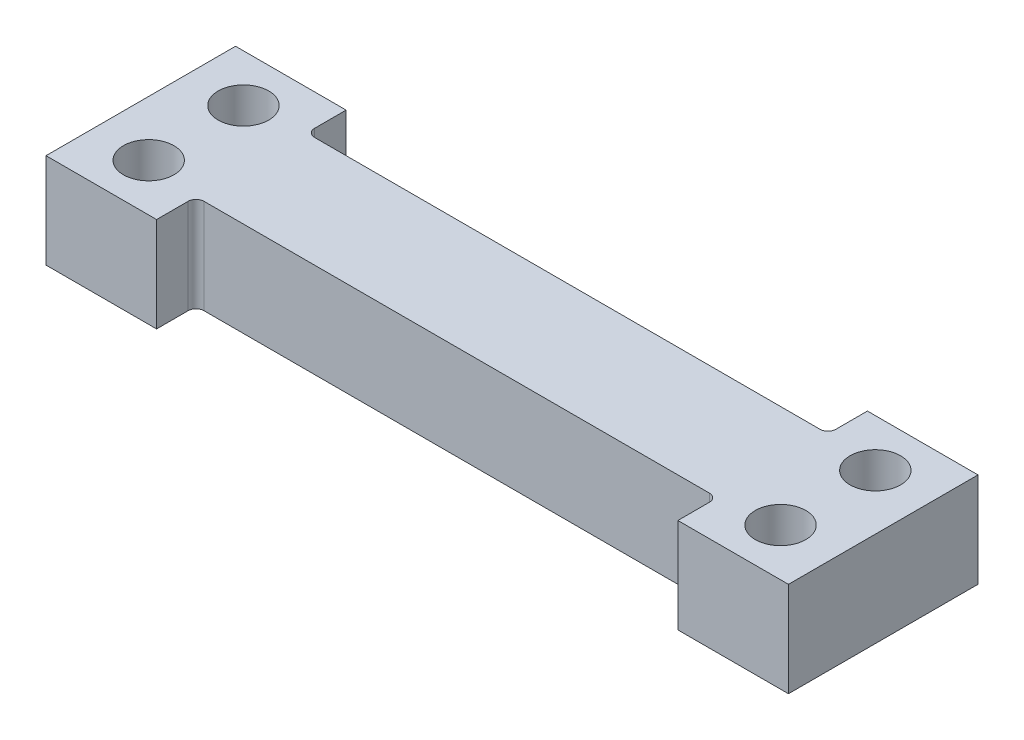
ISO-10303-21;
HEADER;
FILE_DESCRIPTION(('STEP AP214'),'2;1');
FILE_NAME('part.step','',(''),(''),'','','');
FILE_SCHEMA(('AUTOMOTIVE_DESIGN { 1 0 10303 214 1 1 1 1 }'));
ENDSEC;
DATA;
#1=APPLICATION_CONTEXT('core data for automotive mechanical design processes');
#2=APPLICATION_PROTOCOL_DEFINITION('international standard','automotive_design',2000,#1);
#3=PRODUCT_CONTEXT('',#1,'mechanical');
#4=PRODUCT('Part','Part','',(#3));
#5=PRODUCT_RELATED_PRODUCT_CATEGORY('part','',(#4));
#6=PRODUCT_DEFINITION_FORMATION('','',#4);
#7=PRODUCT_DEFINITION_CONTEXT('part definition',#1,'design');
#8=PRODUCT_DEFINITION('design','',#6,#7);
#9=PRODUCT_DEFINITION_SHAPE('','',#8);
#10=(LENGTH_UNIT() NAMED_UNIT(*) SI_UNIT(.MILLI.,.METRE.));
#11=(NAMED_UNIT(*) PLANE_ANGLE_UNIT() SI_UNIT($,.RADIAN.));
#12=(NAMED_UNIT(*) SI_UNIT($,.STERADIAN.) SOLID_ANGLE_UNIT());
#13=UNCERTAINTY_MEASURE_WITH_UNIT(LENGTH_MEASURE(1.E-05),#10,'distance_accuracy_value','');
#14=(GEOMETRIC_REPRESENTATION_CONTEXT(3) GLOBAL_UNCERTAINTY_ASSIGNED_CONTEXT((#13)) GLOBAL_UNIT_ASSIGNED_CONTEXT((#10,
#11,#12)) REPRESENTATION_CONTEXT('',''));
#15=CARTESIAN_POINT('',(0.,0.,0.));
#16=DIRECTION('',(0.,0.,1.));
#17=DIRECTION('',(1.,0.,0.));
#18=AXIS2_PLACEMENT_3D('',#15,#16,#17);
#19=CARTESIAN_POINT('',(0.,6.,0.));
#20=DIRECTION('',(0.,-1.,0.));
#21=DIRECTION('',(0.,0.,-1.));
#22=AXIS2_PLACEMENT_3D('',#19,#20,#21);
#23=PLANE('',#22);
#24=DIRECTION('',(1.,0.,0.));
#25=VECTOR('',#24,1.);
#26=CARTESIAN_POINT('',(7.,6.,0.));
#27=LINE('',#26,#25);
#28=CARTESIAN_POINT('',(0.,6.,0.));
#29=VERTEX_POINT('',#28);
#30=CARTESIAN_POINT('',(7.,6.,0.));
#31=VERTEX_POINT('',#30);
#32=EDGE_CURVE('E163',#29,#31,#27,.T.);
#33=ORIENTED_EDGE('',*,*,#32,.T.);
#34=DIRECTION('',(0.,0.,-1.));
#35=VECTOR('',#34,1.);
#36=CARTESIAN_POINT('',(7.,6.,-2.5));
#37=LINE('',#36,#35);
#38=CARTESIAN_POINT('',(7.,6.,-2.));
#39=VERTEX_POINT('',#38);
#40=EDGE_CURVE('E153',#31,#39,#37,.T.);
#41=ORIENTED_EDGE('',*,*,#40,.T.);
#42=CARTESIAN_POINT('',(7.5,6.,-2.));
#43=DIRECTION('',(0.,-1.,0.));
#44=DIRECTION('',(0.,0.,-1.));
#45=AXIS2_PLACEMENT_3D('',#42,#43,#44);
#46=CIRCLE('',#45,0.5);
#47=CARTESIAN_POINT('',(7.5,6.,-2.5));
#48=VERTEX_POINT('',#47);
#49=EDGE_CURVE('E11',#39,#48,#46,.T.);
#50=ORIENTED_EDGE('',*,*,#49,.T.);
#51=DIRECTION('',(1.,0.,0.));
#52=VECTOR('',#51,1.);
#53=CARTESIAN_POINT('',(40.,6.,-2.5));
#54=LINE('',#53,#52);
#55=CARTESIAN_POINT('',(39.5,6.,-2.5));
#56=VERTEX_POINT('',#55);
#57=EDGE_CURVE('E162',#48,#56,#54,.T.);
#58=ORIENTED_EDGE('',*,*,#57,.T.);
#59=CARTESIAN_POINT('',(39.5,6.,-2.));
#60=DIRECTION('',(0.,-1.,0.));
#61=DIRECTION('',(0.,0.,-1.));
#62=AXIS2_PLACEMENT_3D('',#59,#60,#61);
#63=CIRCLE('',#62,0.5);
#64=CARTESIAN_POINT('',(40.,6.,-2.));
#65=VERTEX_POINT('',#64);
#66=EDGE_CURVE('E229',#56,#65,#63,.T.);
#67=ORIENTED_EDGE('',*,*,#66,.T.);
#68=DIRECTION('',(0.,0.,1.));
#69=VECTOR('',#68,1.);
#70=CARTESIAN_POINT('',(40.,6.,0.));
#71=LINE('',#70,#69);
#72=CARTESIAN_POINT('',(40.,6.,0.));
#73=VERTEX_POINT('',#72);
#74=EDGE_CURVE('E235',#65,#73,#71,.T.);
#75=ORIENTED_EDGE('',*,*,#74,.T.);
#76=DIRECTION('',(1.,0.,0.));
#77=VECTOR('',#76,1.);
#78=CARTESIAN_POINT('',(47.,6.,0.));
#79=LINE('',#78,#77);
#80=CARTESIAN_POINT('',(47.,6.,0.));
#81=VERTEX_POINT('',#80);
#82=EDGE_CURVE('E246',#73,#81,#79,.T.);
#83=ORIENTED_EDGE('',*,*,#82,.T.);
#84=DIRECTION('',(0.,0.,-1.));
#85=VECTOR('',#84,1.);
#86=CARTESIAN_POINT('',(47.,6.,-12.));
#87=LINE('',#86,#85);
#88=CARTESIAN_POINT('',(47.,6.,-12.));
#89=VERTEX_POINT('',#88);
#90=EDGE_CURVE('E318',#81,#89,#87,.T.);
#91=ORIENTED_EDGE('',*,*,#90,.T.);
#92=DIRECTION('',(-1.,0.,0.));
#93=VECTOR('',#92,1.);
#94=CARTESIAN_POINT('',(40.,6.,-12.));
#95=LINE('',#94,#93);
#96=CARTESIAN_POINT('',(40.,6.,-12.));
#97=VERTEX_POINT('',#96);
#98=EDGE_CURVE('E335',#89,#97,#95,.T.);
#99=ORIENTED_EDGE('',*,*,#98,.T.);
#100=DIRECTION('',(0.,0.,1.));
#101=VECTOR('',#100,1.);
#102=CARTESIAN_POINT('',(40.,6.,-9.5));
#103=LINE('',#102,#101);
#104=CARTESIAN_POINT('',(40.,6.,-10.));
#105=VERTEX_POINT('',#104);
#106=EDGE_CURVE('E331',#97,#105,#103,.T.);
#107=ORIENTED_EDGE('',*,*,#106,.T.);
#108=CARTESIAN_POINT('',(39.5,6.,-10.));
#109=DIRECTION('',(0.,-1.,0.));
#110=DIRECTION('',(0.,0.,-1.));
#111=AXIS2_PLACEMENT_3D('',#108,#109,#110);
#112=CIRCLE('',#111,0.5);
#113=CARTESIAN_POINT('',(39.5,6.,-9.5));
#114=VERTEX_POINT('',#113);
#115=EDGE_CURVE('E223',#105,#114,#112,.T.);
#116=ORIENTED_EDGE('',*,*,#115,.T.);
#117=DIRECTION('',(-1.,0.,0.));
#118=VECTOR('',#117,1.);
#119=CARTESIAN_POINT('',(7.,6.,-9.5));
#120=LINE('',#119,#118);
#121=CARTESIAN_POINT('',(7.5,6.,-9.5));
#122=VERTEX_POINT('',#121);
#123=EDGE_CURVE('E334',#114,#122,#120,.T.);
#124=ORIENTED_EDGE('',*,*,#123,.T.);
#125=CARTESIAN_POINT('',(7.5,6.,-10.));
#126=DIRECTION('',(0.,-1.,0.));
#127=DIRECTION('',(0.,0.,-1.));
#128=AXIS2_PLACEMENT_3D('',#125,#126,#127);
#129=CIRCLE('',#128,0.5);
#130=CARTESIAN_POINT('',(7.,6.,-10.));
#131=VERTEX_POINT('',#130);
#132=EDGE_CURVE('E217',#122,#131,#129,.T.);
#133=ORIENTED_EDGE('',*,*,#132,.T.);
#134=DIRECTION('',(0.,0.,-1.));
#135=VECTOR('',#134,1.);
#136=CARTESIAN_POINT('',(7.,6.,-12.));
#137=LINE('',#136,#135);
#138=CARTESIAN_POINT('',(7.,6.,-12.));
#139=VERTEX_POINT('',#138);
#140=EDGE_CURVE('E340',#131,#139,#137,.T.);
#141=ORIENTED_EDGE('',*,*,#140,.T.);
#142=DIRECTION('',(-1.,0.,0.));
#143=VECTOR('',#142,1.);
#144=CARTESIAN_POINT('',(0.,6.,-12.));
#145=LINE('',#144,#143);
#146=CARTESIAN_POINT('',(0.,6.,-12.));
#147=VERTEX_POINT('',#146);
#148=EDGE_CURVE('E347',#139,#147,#145,.T.);
#149=ORIENTED_EDGE('',*,*,#148,.T.);
#150=DIRECTION('',(0.,0.,1.));
#151=VECTOR('',#150,1.);
#152=CARTESIAN_POINT('',(0.,6.,0.));
#153=LINE('',#152,#151);
#154=EDGE_CURVE('E168',#147,#29,#153,.T.);
#155=ORIENTED_EDGE('',*,*,#154,.T.);
#156=EDGE_LOOP('',(#33,#41,#50,#58,#67,#75,#83,#91,#99,#107,#116,#124,#133,#141,#149,#155));
#157=FACE_BOUND('',#156,.T.);
#158=CARTESIAN_POINT('',(3.5,6.,-9.));
#159=DIRECTION('',(0.,1.,0.));
#160=DIRECTION('',(0.,0.,1.));
#161=AXIS2_PLACEMENT_3D('',#158,#159,#160);
#162=CIRCLE('',#161,1.6);
#163=CARTESIAN_POINT('',(3.5,6.,-7.4));
#164=VERTEX_POINT('',#163);
#165=EDGE_CURVE('E352',#164,#164,#162,.T.);
#166=ORIENTED_EDGE('',*,*,#165,.F.);
#167=EDGE_LOOP('',(#166));
#168=FACE_BOUND('',#167,.T.);
#169=CARTESIAN_POINT('',(3.5,6.,-3.));
#170=DIRECTION('',(0.,1.,0.));
#171=DIRECTION('',(0.,0.,1.));
#172=AXIS2_PLACEMENT_3D('',#169,#170,#171);
#173=CIRCLE('',#172,1.6);
#174=CARTESIAN_POINT('',(3.5,6.,-1.4));
#175=VERTEX_POINT('',#174);
#176=EDGE_CURVE('E361',#175,#175,#173,.T.);
#177=ORIENTED_EDGE('',*,*,#176,.F.);
#178=EDGE_LOOP('',(#177));
#179=FACE_BOUND('',#178,.T.);
#180=CARTESIAN_POINT('',(43.5,6.,-3.));
#181=DIRECTION('',(0.,1.,0.));
#182=DIRECTION('',(0.,0.,-1.));
#183=AXIS2_PLACEMENT_3D('',#180,#181,#182);
#184=CIRCLE('',#183,1.6);
#185=CARTESIAN_POINT('',(43.5,6.,-4.60000000000001));
#186=VERTEX_POINT('',#185);
#187=EDGE_CURVE('E638',#186,#186,#184,.T.);
#188=ORIENTED_EDGE('',*,*,#187,.F.);
#189=EDGE_LOOP('',(#188));
#190=FACE_BOUND('',#189,.T.);
#191=CARTESIAN_POINT('',(43.5,6.,-9.));
#192=DIRECTION('',(0.,1.,0.));
#193=DIRECTION('',(0.,0.,-1.));
#194=AXIS2_PLACEMENT_3D('',#191,#192,#193);
#195=CIRCLE('',#194,1.59999999999999);
#196=CARTESIAN_POINT('',(43.5,6.,-10.6));
#197=VERTEX_POINT('',#196);
#198=EDGE_CURVE('E627',#197,#197,#195,.T.);
#199=ORIENTED_EDGE('',*,*,#198,.F.);
#200=EDGE_LOOP('',(#199));
#201=FACE_BOUND('',#200,.T.);
#202=ADVANCED_FACE('F43',(#157,#168,#179,#190,#201),#23,.F.);
#203=CARTESIAN_POINT('',(0.,0.,0.));
#204=DIRECTION('',(0.,-1.,0.));
#205=DIRECTION('',(0.,0.,-1.));
#206=AXIS2_PLACEMENT_3D('',#203,#204,#205);
#207=PLANE('',#206);
#208=CARTESIAN_POINT('',(43.5,0.,-3.));
#209=DIRECTION('',(0.,1.,0.));
#210=DIRECTION('',(0.,0.,-1.));
#211=AXIS2_PLACEMENT_3D('',#208,#209,#210);
#212=CIRCLE('',#211,1.6);
#213=CARTESIAN_POINT('',(43.5,0.,-4.60000000000001));
#214=VERTEX_POINT('',#213);
#215=EDGE_CURVE('E635',#214,#214,#212,.T.);
#216=ORIENTED_EDGE('',*,*,#215,.T.);
#217=EDGE_LOOP('',(#216));
#218=FACE_BOUND('',#217,.T.);
#219=CARTESIAN_POINT('',(3.5,0.,-9.));
#220=DIRECTION('',(0.,1.,0.));
#221=DIRECTION('',(0.,0.,1.));
#222=AXIS2_PLACEMENT_3D('',#219,#220,#221);
#223=CIRCLE('',#222,1.6);
#224=CARTESIAN_POINT('',(3.5,0.,-7.4));
#225=VERTEX_POINT('',#224);
#226=EDGE_CURVE('E355',#225,#225,#223,.T.);
#227=ORIENTED_EDGE('',*,*,#226,.T.);
#228=EDGE_LOOP('',(#227));
#229=FACE_BOUND('',#228,.T.);
#230=DIRECTION('',(1.,0.,0.));
#231=VECTOR('',#230,1.);
#232=CARTESIAN_POINT('',(7.,0.,0.));
#233=LINE('',#232,#231);
#234=CARTESIAN_POINT('',(0.,0.,0.));
#235=VERTEX_POINT('',#234);
#236=CARTESIAN_POINT('',(7.,0.,0.));
#237=VERTEX_POINT('',#236);
#238=EDGE_CURVE('E177',#235,#237,#233,.T.);
#239=ORIENTED_EDGE('',*,*,#238,.F.);
#240=DIRECTION('',(0.,0.,1.));
#241=VECTOR('',#240,1.);
#242=CARTESIAN_POINT('',(0.,0.,0.));
#243=LINE('',#242,#241);
#244=CARTESIAN_POINT('',(0.,0.,-12.));
#245=VERTEX_POINT('',#244);
#246=EDGE_CURVE('E173',#245,#235,#243,.T.);
#247=ORIENTED_EDGE('',*,*,#246,.F.);
#248=DIRECTION('',(-1.,0.,0.));
#249=VECTOR('',#248,1.);
#250=CARTESIAN_POINT('',(0.,0.,-12.));
#251=LINE('',#250,#249);
#252=CARTESIAN_POINT('',(7.,0.,-12.));
#253=VERTEX_POINT('',#252);
#254=EDGE_CURVE('E287',#253,#245,#251,.T.);
#255=ORIENTED_EDGE('',*,*,#254,.F.);
#256=DIRECTION('',(0.,0.,-1.));
#257=VECTOR('',#256,1.);
#258=CARTESIAN_POINT('',(7.,0.,-12.));
#259=LINE('',#258,#257);
#260=CARTESIAN_POINT('',(7.,0.,-10.));
#261=VERTEX_POINT('',#260);
#262=EDGE_CURVE('E284',#261,#253,#259,.T.);
#263=ORIENTED_EDGE('',*,*,#262,.F.);
#264=CARTESIAN_POINT('',(7.5,0.,-10.));
#265=DIRECTION('',(0.,-1.,0.));
#266=DIRECTION('',(0.,0.,-1.));
#267=AXIS2_PLACEMENT_3D('',#264,#265,#266);
#268=CIRCLE('',#267,0.5);
#269=CARTESIAN_POINT('',(7.5,0.,-9.5));
#270=VERTEX_POINT('',#269);
#271=EDGE_CURVE('E214',#261,#270,#268,.F.);
#272=ORIENTED_EDGE('',*,*,#271,.T.);
#273=DIRECTION('',(-1.,0.,0.));
#274=VECTOR('',#273,1.);
#275=CARTESIAN_POINT('',(7.,0.,-9.5));
#276=LINE('',#275,#274);
#277=CARTESIAN_POINT('',(39.5,0.,-9.5));
#278=VERTEX_POINT('',#277);
#279=EDGE_CURVE('E280',#278,#270,#276,.T.);
#280=ORIENTED_EDGE('',*,*,#279,.F.);
#281=CARTESIAN_POINT('',(39.5,0.,-10.));
#282=DIRECTION('',(0.,-1.,0.));
#283=DIRECTION('',(0.,0.,-1.));
#284=AXIS2_PLACEMENT_3D('',#281,#282,#283);
#285=CIRCLE('',#284,0.5);
#286=CARTESIAN_POINT('',(40.,0.,-10.));
#287=VERTEX_POINT('',#286);
#288=EDGE_CURVE('E220',#278,#287,#285,.F.);
#289=ORIENTED_EDGE('',*,*,#288,.T.);
#290=DIRECTION('',(0.,0.,1.));
#291=VECTOR('',#290,1.);
#292=CARTESIAN_POINT('',(40.,0.,-9.5));
#293=LINE('',#292,#291);
#294=CARTESIAN_POINT('',(40.,0.,-12.));
#295=VERTEX_POINT('',#294);
#296=EDGE_CURVE('E276',#295,#287,#293,.T.);
#297=ORIENTED_EDGE('',*,*,#296,.F.);
#298=DIRECTION('',(-1.,0.,0.));
#299=VECTOR('',#298,1.);
#300=CARTESIAN_POINT('',(40.,0.,-12.));
#301=LINE('',#300,#299);
#302=CARTESIAN_POINT('',(47.,0.,-12.));
#303=VERTEX_POINT('',#302);
#304=EDGE_CURVE('E273',#303,#295,#301,.T.);
#305=ORIENTED_EDGE('',*,*,#304,.F.);
#306=DIRECTION('',(0.,0.,-1.));
#307=VECTOR('',#306,1.);
#308=CARTESIAN_POINT('',(47.,0.,-12.));
#309=LINE('',#308,#307);
#310=CARTESIAN_POINT('',(47.,0.,0.));
#311=VERTEX_POINT('',#310);
#312=EDGE_CURVE('E270',#311,#303,#309,.T.);
#313=ORIENTED_EDGE('',*,*,#312,.F.);
#314=DIRECTION('',(1.,0.,0.));
#315=VECTOR('',#314,1.);
#316=CARTESIAN_POINT('',(47.,0.,0.));
#317=LINE('',#316,#315);
#318=CARTESIAN_POINT('',(40.,0.,0.));
#319=VERTEX_POINT('',#318);
#320=EDGE_CURVE('E263',#319,#311,#317,.T.);
#321=ORIENTED_EDGE('',*,*,#320,.F.);
#322=DIRECTION('',(0.,0.,1.));
#323=VECTOR('',#322,1.);
#324=CARTESIAN_POINT('',(40.,0.,0.));
#325=LINE('',#324,#323);
#326=CARTESIAN_POINT('',(40.,0.,-2.));
#327=VERTEX_POINT('',#326);
#328=EDGE_CURVE('E254',#327,#319,#325,.T.);
#329=ORIENTED_EDGE('',*,*,#328,.F.);
#330=CARTESIAN_POINT('',(39.5,0.,-2.));
#331=DIRECTION('',(0.,-1.,0.));
#332=DIRECTION('',(0.,0.,-1.));
#333=AXIS2_PLACEMENT_3D('',#330,#331,#332);
#334=CIRCLE('',#333,0.5);
#335=CARTESIAN_POINT('',(39.5,0.,-2.5));
#336=VERTEX_POINT('',#335);
#337=EDGE_CURVE('E226',#327,#336,#334,.F.);
#338=ORIENTED_EDGE('',*,*,#337,.T.);
#339=DIRECTION('',(1.,0.,0.));
#340=VECTOR('',#339,1.);
#341=CARTESIAN_POINT('',(40.,0.,-2.5));
#342=LINE('',#341,#340);
#343=CARTESIAN_POINT('',(7.5,0.,-2.5));
#344=VERTEX_POINT('',#343);
#345=EDGE_CURVE('E252',#344,#336,#342,.T.);
#346=ORIENTED_EDGE('',*,*,#345,.F.);
#347=CARTESIAN_POINT('',(7.5,0.,-2.));
#348=DIRECTION('',(0.,-1.,0.));
#349=DIRECTION('',(0.,0.,-1.));
#350=AXIS2_PLACEMENT_3D('',#347,#348,#349);
#351=CIRCLE('',#350,0.5);
#352=CARTESIAN_POINT('',(7.,0.,-2.));
#353=VERTEX_POINT('',#352);
#354=EDGE_CURVE('E52',#344,#353,#351,.F.);
#355=ORIENTED_EDGE('',*,*,#354,.T.);
#356=DIRECTION('',(0.,0.,-1.));
#357=VECTOR('',#356,1.);
#358=CARTESIAN_POINT('',(7.,0.,-2.5));
#359=LINE('',#358,#357);
#360=EDGE_CURVE('E259',#237,#353,#359,.T.);
#361=ORIENTED_EDGE('',*,*,#360,.F.);
#362=EDGE_LOOP('',(#239,#247,#255,#263,#272,#280,#289,#297,#305,#313,#321,#329,#338,#346,#355,#361));
#363=FACE_BOUND('',#362,.T.);
#364=CARTESIAN_POINT('',(3.5,0.,-3.));
#365=DIRECTION('',(0.,1.,0.));
#366=DIRECTION('',(0.,0.,1.));
#367=AXIS2_PLACEMENT_3D('',#364,#365,#366);
#368=CIRCLE('',#367,1.6);
#369=CARTESIAN_POINT('',(3.5,0.,-1.4));
#370=VERTEX_POINT('',#369);
#371=EDGE_CURVE('E364',#370,#370,#368,.T.);
#372=ORIENTED_EDGE('',*,*,#371,.T.);
#373=EDGE_LOOP('',(#372));
#374=FACE_BOUND('',#373,.T.);
#375=CARTESIAN_POINT('',(43.5,0.,-9.));
#376=DIRECTION('',(0.,1.,0.));
#377=DIRECTION('',(0.,0.,-1.));
#378=AXIS2_PLACEMENT_3D('',#375,#376,#377);
#379=CIRCLE('',#378,1.59999999999999);
#380=CARTESIAN_POINT('',(43.5,0.,-10.6));
#381=VERTEX_POINT('',#380);
#382=EDGE_CURVE('E630',#381,#381,#379,.T.);
#383=ORIENTED_EDGE('',*,*,#382,.T.);
#384=EDGE_LOOP('',(#383));
#385=FACE_BOUND('',#384,.T.);
#386=ADVANCED_FACE('F250',(#218,#229,#363,#374,#385),#207,.T.);
#387=CARTESIAN_POINT('',(7.,6.,0.));
#388=DIRECTION('',(0.,0.,-1.));
#389=DIRECTION('',(-1.,0.,0.));
#390=AXIS2_PLACEMENT_3D('',#387,#388,#389);
#391=PLANE('',#390);
#392=ORIENTED_EDGE('',*,*,#238,.T.);
#393=DIRECTION('',(0.,-1.,0.));
#394=VECTOR('',#393,1.);
#395=CARTESIAN_POINT('',(7.,6.,0.));
#396=LINE('',#395,#394);
#397=EDGE_CURVE('E157',#31,#237,#396,.T.);
#398=ORIENTED_EDGE('',*,*,#397,.F.);
#399=ORIENTED_EDGE('',*,*,#32,.F.);
#400=DIRECTION('',(0.,-1.,0.));
#401=VECTOR('',#400,1.);
#402=CARTESIAN_POINT('',(0.,6.,0.));
#403=LINE('',#402,#401);
#404=EDGE_CURVE('E292',#29,#235,#403,.T.);
#405=ORIENTED_EDGE('',*,*,#404,.T.);
#406=EDGE_LOOP('',(#392,#398,#399,#405));
#407=FACE_BOUND('',#406,.T.);
#408=ADVANCED_FACE('F175',(#407),#391,.F.);
#409=CARTESIAN_POINT('',(7.,6.,-2.5));
#410=DIRECTION('',(-1.,0.,0.));
#411=DIRECTION('',(0.,0.,1.));
#412=AXIS2_PLACEMENT_3D('',#409,#410,#411);
#413=PLANE('',#412);
#414=ORIENTED_EDGE('',*,*,#360,.T.);
#415=DIRECTION('',(0.,-1.,0.));
#416=VECTOR('',#415,1.);
#417=CARTESIAN_POINT('',(7.,6.,-2.));
#418=LINE('',#417,#416);
#419=EDGE_CURVE('E59',#353,#39,#418,.F.);
#420=ORIENTED_EDGE('',*,*,#419,.T.);
#421=ORIENTED_EDGE('',*,*,#40,.F.);
#422=ORIENTED_EDGE('',*,*,#397,.T.);
#423=EDGE_LOOP('',(#414,#420,#421,#422));
#424=FACE_BOUND('',#423,.T.);
#425=ADVANCED_FACE('F155',(#424),#413,.F.);
#426=CARTESIAN_POINT('',(40.,6.,-2.5));
#427=DIRECTION('',(0.,0.,-1.));
#428=DIRECTION('',(-1.,0.,0.));
#429=AXIS2_PLACEMENT_3D('',#426,#427,#428);
#430=PLANE('',#429);
#431=ORIENTED_EDGE('',*,*,#345,.T.);
#432=DIRECTION('',(0.,-1.,0.));
#433=VECTOR('',#432,1.);
#434=CARTESIAN_POINT('',(39.5,6.,-2.5));
#435=LINE('',#434,#433);
#436=EDGE_CURVE('E209',#336,#56,#435,.F.);
#437=ORIENTED_EDGE('',*,*,#436,.T.);
#438=ORIENTED_EDGE('',*,*,#57,.F.);
#439=DIRECTION('',(0.,-1.,0.));
#440=VECTOR('',#439,1.);
#441=CARTESIAN_POINT('',(7.5,0.,-2.5));
#442=LINE('',#441,#440);
#443=EDGE_CURVE('E205',#48,#344,#442,.T.);
#444=ORIENTED_EDGE('',*,*,#443,.T.);
#445=EDGE_LOOP('',(#431,#437,#438,#444));
#446=FACE_BOUND('',#445,.T.);
#447=ADVANCED_FACE('F256',(#446),#430,.F.);
#448=CARTESIAN_POINT('',(40.,6.,0.));
#449=DIRECTION('',(1.,0.,0.));
#450=DIRECTION('',(0.,0.,-1.));
#451=AXIS2_PLACEMENT_3D('',#448,#449,#450);
#452=PLANE('',#451);
#453=ORIENTED_EDGE('',*,*,#74,.F.);
#454=DIRECTION('',(0.,-1.,0.));
#455=VECTOR('',#454,1.);
#456=CARTESIAN_POINT('',(40.,0.,-2.));
#457=LINE('',#456,#455);
#458=EDGE_CURVE('E201',#65,#327,#457,.T.);
#459=ORIENTED_EDGE('',*,*,#458,.T.);
#460=ORIENTED_EDGE('',*,*,#328,.T.);
#461=DIRECTION('',(0.,-1.,0.));
#462=VECTOR('',#461,1.);
#463=CARTESIAN_POINT('',(40.,6.,0.));
#464=LINE('',#463,#462);
#465=EDGE_CURVE('E180',#73,#319,#464,.T.);
#466=ORIENTED_EDGE('',*,*,#465,.F.);
#467=EDGE_LOOP('',(#453,#459,#460,#466));
#468=FACE_BOUND('',#467,.T.);
#469=ADVANCED_FACE('F242',(#468),#452,.F.);
#470=CARTESIAN_POINT('',(47.,6.,0.));
#471=DIRECTION('',(0.,0.,-1.));
#472=DIRECTION('',(-1.,0.,0.));
#473=AXIS2_PLACEMENT_3D('',#470,#471,#472);
#474=PLANE('',#473);
#475=ORIENTED_EDGE('',*,*,#320,.T.);
#476=DIRECTION('',(0.,-1.,0.));
#477=VECTOR('',#476,1.);
#478=CARTESIAN_POINT('',(47.,6.,0.));
#479=LINE('',#478,#477);
#480=EDGE_CURVE('E188',#81,#311,#479,.T.);
#481=ORIENTED_EDGE('',*,*,#480,.F.);
#482=ORIENTED_EDGE('',*,*,#82,.F.);
#483=ORIENTED_EDGE('',*,*,#465,.T.);
#484=EDGE_LOOP('',(#475,#481,#482,#483));
#485=FACE_BOUND('',#484,.T.);
#486=ADVANCED_FACE('F371',(#485),#474,.F.);
#487=CARTESIAN_POINT('',(47.,6.,-12.));
#488=DIRECTION('',(-1.,0.,0.));
#489=DIRECTION('',(0.,0.,1.));
#490=AXIS2_PLACEMENT_3D('',#487,#488,#489);
#491=PLANE('',#490);
#492=ORIENTED_EDGE('',*,*,#312,.T.);
#493=DIRECTION('',(0.,-1.,0.));
#494=VECTOR('',#493,1.);
#495=CARTESIAN_POINT('',(47.,6.,-12.));
#496=LINE('',#495,#494);
#497=EDGE_CURVE('E307',#89,#303,#496,.T.);
#498=ORIENTED_EDGE('',*,*,#497,.F.);
#499=ORIENTED_EDGE('',*,*,#90,.F.);
#500=ORIENTED_EDGE('',*,*,#480,.T.);
#501=EDGE_LOOP('',(#492,#498,#499,#500));
#502=FACE_BOUND('',#501,.T.);
#503=ADVANCED_FACE('F316',(#502),#491,.F.);
#504=CARTESIAN_POINT('',(40.,6.,-12.));
#505=DIRECTION('',(0.,0.,1.));
#506=DIRECTION('',(1.,0.,0.));
#507=AXIS2_PLACEMENT_3D('',#504,#505,#506);
#508=PLANE('',#507);
#509=ORIENTED_EDGE('',*,*,#304,.T.);
#510=DIRECTION('',(0.,-1.,0.));
#511=VECTOR('',#510,1.);
#512=CARTESIAN_POINT('',(40.,6.,-12.));
#513=LINE('',#512,#511);
#514=EDGE_CURVE('E303',#97,#295,#513,.T.);
#515=ORIENTED_EDGE('',*,*,#514,.F.);
#516=ORIENTED_EDGE('',*,*,#98,.F.);
#517=ORIENTED_EDGE('',*,*,#497,.T.);
#518=EDGE_LOOP('',(#509,#515,#516,#517));
#519=FACE_BOUND('',#518,.T.);
#520=ADVANCED_FACE('F324',(#519),#508,.F.);
#521=CARTESIAN_POINT('',(40.,6.,-9.5));
#522=DIRECTION('',(1.,0.,0.));
#523=DIRECTION('',(0.,0.,-1.));
#524=AXIS2_PLACEMENT_3D('',#521,#522,#523);
#525=PLANE('',#524);
#526=ORIENTED_EDGE('',*,*,#296,.T.);
#527=DIRECTION('',(0.,-1.,0.));
#528=VECTOR('',#527,1.);
#529=CARTESIAN_POINT('',(40.,6.,-10.));
#530=LINE('',#529,#528);
#531=EDGE_CURVE('E198',#287,#105,#530,.F.);
#532=ORIENTED_EDGE('',*,*,#531,.T.);
#533=ORIENTED_EDGE('',*,*,#106,.F.);
#534=ORIENTED_EDGE('',*,*,#514,.T.);
#535=EDGE_LOOP('',(#526,#532,#533,#534));
#536=FACE_BOUND('',#535,.T.);
#537=ADVANCED_FACE('F328',(#536),#525,.F.);
#538=CARTESIAN_POINT('',(7.,6.,-9.5));
#539=DIRECTION('',(0.,0.,1.));
#540=DIRECTION('',(1.,0.,0.));
#541=AXIS2_PLACEMENT_3D('',#538,#539,#540);
#542=PLANE('',#541);
#543=ORIENTED_EDGE('',*,*,#279,.T.);
#544=DIRECTION('',(0.,-1.,0.));
#545=VECTOR('',#544,1.);
#546=CARTESIAN_POINT('',(7.5,6.,-9.5));
#547=LINE('',#546,#545);
#548=EDGE_CURVE('E195',#270,#122,#547,.F.);
#549=ORIENTED_EDGE('',*,*,#548,.T.);
#550=ORIENTED_EDGE('',*,*,#123,.F.);
#551=DIRECTION('',(0.,-1.,0.));
#552=VECTOR('',#551,1.);
#553=CARTESIAN_POINT('',(39.5,0.,-9.5));
#554=LINE('',#553,#552);
#555=EDGE_CURVE('E185',#114,#278,#554,.T.);
#556=ORIENTED_EDGE('',*,*,#555,.T.);
#557=EDGE_LOOP('',(#543,#549,#550,#556));
#558=FACE_BOUND('',#557,.T.);
#559=ADVANCED_FACE('F402',(#558),#542,.F.);
#560=CARTESIAN_POINT('',(7.,6.,-12.));
#561=DIRECTION('',(-1.,0.,0.));
#562=DIRECTION('',(0.,0.,1.));
#563=AXIS2_PLACEMENT_3D('',#560,#561,#562);
#564=PLANE('',#563);
#565=ORIENTED_EDGE('',*,*,#140,.F.);
#566=DIRECTION('',(0.,-1.,0.));
#567=VECTOR('',#566,1.);
#568=CARTESIAN_POINT('',(7.,0.,-10.));
#569=LINE('',#568,#567);
#570=EDGE_CURVE('E179',#131,#261,#569,.T.);
#571=ORIENTED_EDGE('',*,*,#570,.T.);
#572=ORIENTED_EDGE('',*,*,#262,.T.);
#573=DIRECTION('',(0.,-1.,0.));
#574=VECTOR('',#573,1.);
#575=CARTESIAN_POINT('',(7.,6.,-12.));
#576=LINE('',#575,#574);
#577=EDGE_CURVE('E299',#139,#253,#576,.T.);
#578=ORIENTED_EDGE('',*,*,#577,.F.);
#579=EDGE_LOOP('',(#565,#571,#572,#578));
#580=FACE_BOUND('',#579,.T.);
#581=ADVANCED_FACE('F398',(#580),#564,.F.);
#582=CARTESIAN_POINT('',(0.,6.,-12.));
#583=DIRECTION('',(0.,0.,1.));
#584=DIRECTION('',(1.,0.,0.));
#585=AXIS2_PLACEMENT_3D('',#582,#583,#584);
#586=PLANE('',#585);
#587=ORIENTED_EDGE('',*,*,#254,.T.);
#588=DIRECTION('',(0.,-1.,0.));
#589=VECTOR('',#588,1.);
#590=CARTESIAN_POINT('',(0.,6.,-12.));
#591=LINE('',#590,#589);
#592=EDGE_CURVE('E295',#147,#245,#591,.T.);
#593=ORIENTED_EDGE('',*,*,#592,.F.);
#594=ORIENTED_EDGE('',*,*,#148,.F.);
#595=ORIENTED_EDGE('',*,*,#577,.T.);
#596=EDGE_LOOP('',(#587,#593,#594,#595));
#597=FACE_BOUND('',#596,.T.);
#598=ADVANCED_FACE('F394',(#597),#586,.F.);
#599=CARTESIAN_POINT('',(0.,6.,0.));
#600=DIRECTION('',(1.,0.,0.));
#601=DIRECTION('',(0.,0.,-1.));
#602=AXIS2_PLACEMENT_3D('',#599,#600,#601);
#603=PLANE('',#602);
#604=ORIENTED_EDGE('',*,*,#246,.T.);
#605=ORIENTED_EDGE('',*,*,#404,.F.);
#606=ORIENTED_EDGE('',*,*,#154,.F.);
#607=ORIENTED_EDGE('',*,*,#592,.T.);
#608=EDGE_LOOP('',(#604,#605,#606,#607));
#609=FACE_BOUND('',#608,.T.);
#610=ADVANCED_FACE('F391',(#609),#603,.F.);
#611=CARTESIAN_POINT('',(3.5,6.,-9.));
#612=DIRECTION('',(0.,-1.,0.));
#613=DIRECTION('',(0.,0.,-1.));
#614=AXIS2_PLACEMENT_3D('',#611,#612,#613);
#615=CYLINDRICAL_SURFACE('',#614,1.6);
#616=ORIENTED_EDGE('',*,*,#165,.T.);
#617=EDGE_LOOP('',(#616));
#618=FACE_BOUND('',#617,.T.);
#619=ORIENTED_EDGE('',*,*,#226,.F.);
#620=EDGE_LOOP('',(#619));
#621=FACE_BOUND('',#620,.T.);
#622=ADVANCED_FACE('F388',(#618,#621),#615,.F.);
#623=CARTESIAN_POINT('',(3.5,6.,-3.));
#624=DIRECTION('',(0.,-1.,0.));
#625=DIRECTION('',(0.,0.,-1.));
#626=AXIS2_PLACEMENT_3D('',#623,#624,#625);
#627=CYLINDRICAL_SURFACE('',#626,1.6);
#628=ORIENTED_EDGE('',*,*,#176,.T.);
#629=EDGE_LOOP('',(#628));
#630=FACE_BOUND('',#629,.T.);
#631=ORIENTED_EDGE('',*,*,#371,.F.);
#632=EDGE_LOOP('',(#631));
#633=FACE_BOUND('',#632,.T.);
#634=ADVANCED_FACE('F442',(#630,#633),#627,.F.);
#635=CARTESIAN_POINT('',(43.5,6.,-3.));
#636=DIRECTION('',(0.,-1.,0.));
#637=DIRECTION('',(0.,0.,-1.));
#638=AXIS2_PLACEMENT_3D('',#635,#636,#637);
#639=CYLINDRICAL_SURFACE('',#638,1.6);
#640=ORIENTED_EDGE('',*,*,#187,.T.);
#641=EDGE_LOOP('',(#640));
#642=FACE_BOUND('',#641,.T.);
#643=ORIENTED_EDGE('',*,*,#215,.F.);
#644=EDGE_LOOP('',(#643));
#645=FACE_BOUND('',#644,.T.);
#646=ADVANCED_FACE('F448',(#642,#645),#639,.F.);
#647=CARTESIAN_POINT('',(43.5,6.,-9.));
#648=DIRECTION('',(0.,-1.,0.));
#649=DIRECTION('',(0.,0.,-1.));
#650=AXIS2_PLACEMENT_3D('',#647,#648,#649);
#651=CYLINDRICAL_SURFACE('',#650,1.59999999999999);
#652=ORIENTED_EDGE('',*,*,#198,.T.);
#653=EDGE_LOOP('',(#652));
#654=FACE_BOUND('',#653,.T.);
#655=ORIENTED_EDGE('',*,*,#382,.F.);
#656=EDGE_LOOP('',(#655));
#657=FACE_BOUND('',#656,.T.);
#658=ADVANCED_FACE('F455',(#654,#657),#651,.F.);
#659=CARTESIAN_POINT('',(7.5,6.,-10.));
#660=DIRECTION('',(0.,1.,0.));
#661=DIRECTION('',(0.,0.,1.));
#662=AXIS2_PLACEMENT_3D('',#659,#660,#661);
#663=CYLINDRICAL_SURFACE('',#662,0.5);
#664=ORIENTED_EDGE('',*,*,#132,.F.);
#665=ORIENTED_EDGE('',*,*,#548,.F.);
#666=ORIENTED_EDGE('',*,*,#271,.F.);
#667=ORIENTED_EDGE('',*,*,#570,.F.);
#668=EDGE_LOOP('',(#664,#665,#666,#667));
#669=FACE_BOUND('',#668,.T.);
#670=ADVANCED_FACE('F463',(#669),#663,.F.);
#671=CARTESIAN_POINT('',(39.5,6.,-10.));
#672=DIRECTION('',(0.,1.,0.));
#673=DIRECTION('',(0.,0.,1.));
#674=AXIS2_PLACEMENT_3D('',#671,#672,#673);
#675=CYLINDRICAL_SURFACE('',#674,0.5);
#676=ORIENTED_EDGE('',*,*,#115,.F.);
#677=ORIENTED_EDGE('',*,*,#531,.F.);
#678=ORIENTED_EDGE('',*,*,#288,.F.);
#679=ORIENTED_EDGE('',*,*,#555,.F.);
#680=EDGE_LOOP('',(#676,#677,#678,#679));
#681=FACE_BOUND('',#680,.T.);
#682=ADVANCED_FACE('F470',(#681),#675,.F.);
#683=CARTESIAN_POINT('',(39.5,6.,-2.));
#684=DIRECTION('',(0.,1.,0.));
#685=DIRECTION('',(0.,0.,1.));
#686=AXIS2_PLACEMENT_3D('',#683,#684,#685);
#687=CYLINDRICAL_SURFACE('',#686,0.5);
#688=ORIENTED_EDGE('',*,*,#66,.F.);
#689=ORIENTED_EDGE('',*,*,#436,.F.);
#690=ORIENTED_EDGE('',*,*,#337,.F.);
#691=ORIENTED_EDGE('',*,*,#458,.F.);
#692=EDGE_LOOP('',(#688,#689,#690,#691));
#693=FACE_BOUND('',#692,.T.);
#694=ADVANCED_FACE('F248',(#693),#687,.F.);
#695=CARTESIAN_POINT('',(7.5,6.,-2.));
#696=DIRECTION('',(0.,1.,0.));
#697=DIRECTION('',(0.,0.,1.));
#698=AXIS2_PLACEMENT_3D('',#695,#696,#697);
#699=CYLINDRICAL_SURFACE('',#698,0.5);
#700=ORIENTED_EDGE('',*,*,#49,.F.);
#701=ORIENTED_EDGE('',*,*,#419,.F.);
#702=ORIENTED_EDGE('',*,*,#354,.F.);
#703=ORIENTED_EDGE('',*,*,#443,.F.);
#704=EDGE_LOOP('',(#700,#701,#702,#703));
#705=FACE_BOUND('',#704,.T.);
#706=ADVANCED_FACE('F45',(#705),#699,.F.);
#707=CLOSED_SHELL('',(#202,#386,#408,#425,#447,#469,#486,#503,#520,#537,#559,#581,#598,#610,
#622,#634,#646,#658,#670,#682,#694,#706));
#708=MANIFOLD_SOLID_BREP('B2',#707);
#709=ADVANCED_BREP_SHAPE_REPRESENTATION('',(#18,#708),#14);
#710=SHAPE_DEFINITION_REPRESENTATION(#9,#709);
ENDSEC;
END-ISO-10303-21;
